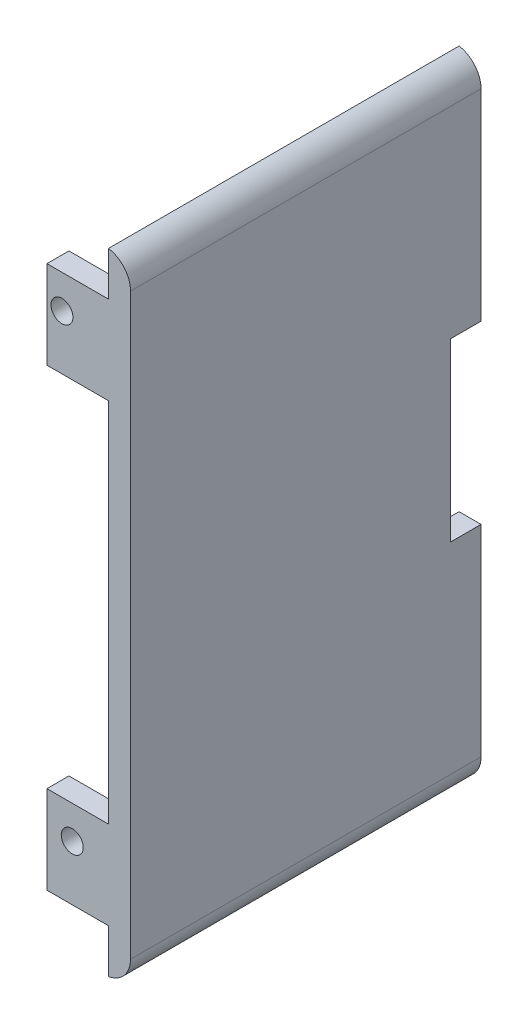
ISO-10303-21;
HEADER;
FILE_DESCRIPTION(('STEP AP214'),'2;1');
FILE_NAME('part.step','',(''),(''),'','','');
FILE_SCHEMA(('AUTOMOTIVE_DESIGN { 1 0 10303 214 1 1 1 1 }'));
ENDSEC;
DATA;
#1=APPLICATION_CONTEXT('core data for automotive mechanical design processes');
#2=APPLICATION_PROTOCOL_DEFINITION('international standard','automotive_design',2000,#1);
#3=PRODUCT_CONTEXT('',#1,'mechanical');
#4=PRODUCT('Part','Part','',(#3));
#5=PRODUCT_RELATED_PRODUCT_CATEGORY('part','',(#4));
#6=PRODUCT_DEFINITION_FORMATION('','',#4);
#7=PRODUCT_DEFINITION_CONTEXT('part definition',#1,'design');
#8=PRODUCT_DEFINITION('design','',#6,#7);
#9=PRODUCT_DEFINITION_SHAPE('','',#8);
#10=(LENGTH_UNIT() NAMED_UNIT(*) SI_UNIT(.MILLI.,.METRE.));
#11=(NAMED_UNIT(*) PLANE_ANGLE_UNIT() SI_UNIT($,.RADIAN.));
#12=(NAMED_UNIT(*) SI_UNIT($,.STERADIAN.) SOLID_ANGLE_UNIT());
#13=UNCERTAINTY_MEASURE_WITH_UNIT(LENGTH_MEASURE(1.E-05),#10,'distance_accuracy_value','');
#14=(GEOMETRIC_REPRESENTATION_CONTEXT(3) GLOBAL_UNCERTAINTY_ASSIGNED_CONTEXT((#13)) GLOBAL_UNIT_ASSIGNED_CONTEXT((#10,
#11,#12)) REPRESENTATION_CONTEXT('',''));
#15=CARTESIAN_POINT('',(0.,0.,0.));
#16=DIRECTION('',(0.,0.,1.));
#17=DIRECTION('',(1.,0.,0.));
#18=AXIS2_PLACEMENT_3D('',#15,#16,#17);
#19=CARTESIAN_POINT('',(-104.891736532619,71.4003118807174,-79.6889603598296));
#20=DIRECTION('',(0.,0.,1.));
#21=DIRECTION('',(1.,0.,0.));
#22=AXIS2_PLACEMENT_3D('',#19,#20,#21);
#23=PLANE('',#22);
#24=DIRECTION('',(0.,-1.,0.));
#25=VECTOR('',#24,1.);
#26=CARTESIAN_POINT('',(-99.8917365326188,71.4003118807174,-79.6889603598296));
#27=LINE('',#26,#25);
#28=CARTESIAN_POINT('',(-99.8917365326188,65.4842320976178,-79.6889603598296));
#29=VERTEX_POINT('',#28);
#30=CARTESIAN_POINT('',(-99.8917365326188,19.7210142017408,-79.6889603598296));
#31=VERTEX_POINT('',#30);
#32=EDGE_CURVE('E201',#29,#31,#27,.T.);
#33=ORIENTED_EDGE('',*,*,#32,.T.);
#34=DIRECTION('',(-1.,0.,0.));
#35=VECTOR('',#34,1.);
#36=CARTESIAN_POINT('',(-94.8917365326188,19.7210142017408,-79.6889603598296));
#37=LINE('',#36,#35);
#38=CARTESIAN_POINT('',(-104.891736532619,19.7210142017408,-79.6889603598296));
#39=VERTEX_POINT('',#38);
#40=EDGE_CURVE('E334',#31,#39,#37,.T.);
#41=ORIENTED_EDGE('',*,*,#40,.T.);
#42=DIRECTION('',(0.,-1.,0.));
#43=VECTOR('',#42,1.);
#44=CARTESIAN_POINT('',(-104.891736532619,71.4003118807174,-79.6889603598296));
#45=LINE('',#44,#43);
#46=CARTESIAN_POINT('',(-104.891736532619,71.4003118807174,-79.6889603598296));
#47=VERTEX_POINT('',#46);
#48=EDGE_CURVE('E183',#47,#39,#45,.T.);
#49=ORIENTED_EDGE('',*,*,#48,.F.);
#50=CARTESIAN_POINT('',(-105.891736532619,65.4842320976178,-79.6889603598296));
#51=DIRECTION('',(0.,0.,1.));
#52=DIRECTION('',(1.,0.,0.));
#53=AXIS2_PLACEMENT_3D('',#50,#51,#52);
#54=CIRCLE('',#53,6.);
#55=EDGE_CURVE('E218',#47,#29,#54,.F.);
#56=ORIENTED_EDGE('',*,*,#55,.T.);
#57=EDGE_LOOP('',(#33,#41,#49,#56));
#58=FACE_BOUND('',#57,.T.);
#59=ADVANCED_FACE('F45',(#58),#23,.F.);
#60=CARTESIAN_POINT('',(-104.891736532619,0.,0.));
#61=DIRECTION('',(1.,0.,0.));
#62=DIRECTION('',(0.,0.,-1.));
#63=AXIS2_PLACEMENT_3D('',#60,#61,#62);
#64=PLANE('',#63);
#65=ORIENTED_EDGE('',*,*,#48,.T.);
#66=DIRECTION('',(0.,0.,-1.));
#67=VECTOR('',#66,1.);
#68=CARTESIAN_POINT('',(-104.891736532619,19.7210142017408,-79.6889603598296));
#69=LINE('',#68,#67);
#70=CARTESIAN_POINT('',(-104.891736532619,19.7210142017408,-72.6889603598296));
#71=VERTEX_POINT('',#70);
#72=EDGE_CURVE('E166',#71,#39,#69,.T.);
#73=ORIENTED_EDGE('',*,*,#72,.F.);
#74=DIRECTION('',(0.,1.,0.));
#75=VECTOR('',#74,1.);
#76=CARTESIAN_POINT('',(-104.891736532619,19.7210142017408,-72.6889603598296));
#77=LINE('',#76,#75);
#78=CARTESIAN_POINT('',(-104.891736532619,-20.2789857982592,-72.6889603598296));
#79=VERTEX_POINT('',#78);
#80=EDGE_CURVE('E175',#79,#71,#77,.T.);
#81=ORIENTED_EDGE('',*,*,#80,.F.);
#82=DIRECTION('',(0.,0.,1.));
#83=VECTOR('',#82,1.);
#84=CARTESIAN_POINT('',(-104.891736532619,-20.2789857982592,-79.6889603598296));
#85=LINE('',#84,#83);
#86=CARTESIAN_POINT('',(-104.891736532619,-20.2789857982592,-79.6889603598296));
#87=VERTEX_POINT('',#86);
#88=EDGE_CURVE('E160',#87,#79,#85,.T.);
#89=ORIENTED_EDGE('',*,*,#88,.F.);
#90=CARTESIAN_POINT('',(-104.891736532619,-71.9582834772358,-79.6889603598296));
#91=VERTEX_POINT('',#90);
#92=EDGE_CURVE('E172',#87,#91,#45,.T.);
#93=ORIENTED_EDGE('',*,*,#92,.T.);
#94=DIRECTION('',(0.,0.,1.));
#95=VECTOR('',#94,1.);
#96=CARTESIAN_POINT('',(-104.891736532619,-71.9582834772358,0.));
#97=LINE('',#96,#95);
#98=CARTESIAN_POINT('',(-104.891736532619,-71.9582834772358,0.));
#99=VERTEX_POINT('',#98);
#100=EDGE_CURVE('E188',#91,#99,#97,.T.);
#101=ORIENTED_EDGE('',*,*,#100,.T.);
#102=DIRECTION('',(0.,1.,0.));
#103=VECTOR('',#102,1.);
#104=CARTESIAN_POINT('',(-104.891736532619,71.4003118807174,0.));
#105=LINE('',#104,#103);
#106=CARTESIAN_POINT('',(-104.891736532619,-61.9582834772358,0.));
#107=VERTEX_POINT('',#106);
#108=EDGE_CURVE('E190',#99,#107,#105,.T.);
#109=ORIENTED_EDGE('',*,*,#108,.T.);
#110=DIRECTION('',(0.,0.,1.));
#111=VECTOR('',#110,1.);
#112=CARTESIAN_POINT('',(-104.891736532619,-61.9582834772358,0.));
#113=LINE('',#112,#111);
#114=CARTESIAN_POINT('',(-104.891736532619,-61.9582834772358,-5.));
#115=VERTEX_POINT('',#114);
#116=EDGE_CURVE('E265',#115,#107,#113,.T.);
#117=ORIENTED_EDGE('',*,*,#116,.F.);
#118=DIRECTION('',(0.,-1.,0.));
#119=VECTOR('',#118,1.);
#120=CARTESIAN_POINT('',(-104.891736532619,-61.9582834772358,-5.));
#121=LINE('',#120,#119);
#122=CARTESIAN_POINT('',(-104.891736532619,-41.9582834772358,-5.));
#123=VERTEX_POINT('',#122);
#124=EDGE_CURVE('E269',#123,#115,#121,.T.);
#125=ORIENTED_EDGE('',*,*,#124,.F.);
#126=DIRECTION('',(0.,0.,-1.));
#127=VECTOR('',#126,1.);
#128=CARTESIAN_POINT('',(-104.891736532619,-41.9582834772358,0.));
#129=LINE('',#128,#127);
#130=CARTESIAN_POINT('',(-104.891736532619,-41.9582834772358,0.));
#131=VERTEX_POINT('',#130);
#132=EDGE_CURVE('E273',#131,#123,#129,.T.);
#133=ORIENTED_EDGE('',*,*,#132,.F.);
#134=CARTESIAN_POINT('',(-104.891736532619,41.4003118807174,0.));
#135=VERTEX_POINT('',#134);
#136=EDGE_CURVE('E347',#131,#135,#105,.T.);
#137=ORIENTED_EDGE('',*,*,#136,.T.);
#138=DIRECTION('',(0.,0.,1.));
#139=VECTOR('',#138,1.);
#140=CARTESIAN_POINT('',(-104.891736532619,41.4003118807174,0.));
#141=LINE('',#140,#139);
#142=CARTESIAN_POINT('',(-104.891736532619,41.4003118807174,-5.00000000000001));
#143=VERTEX_POINT('',#142);
#144=EDGE_CURVE('E285',#143,#135,#141,.T.);
#145=ORIENTED_EDGE('',*,*,#144,.F.);
#146=DIRECTION('',(0.,-1.,0.));
#147=VECTOR('',#146,1.);
#148=CARTESIAN_POINT('',(-104.891736532619,61.4003118807174,-5.00000000000002));
#149=LINE('',#148,#147);
#150=CARTESIAN_POINT('',(-104.891736532619,61.4003118807174,-5.00000000000002));
#151=VERTEX_POINT('',#150);
#152=EDGE_CURVE('E281',#151,#143,#149,.T.);
#153=ORIENTED_EDGE('',*,*,#152,.F.);
#154=DIRECTION('',(0.,0.,-1.));
#155=VECTOR('',#154,1.);
#156=CARTESIAN_POINT('',(-104.891736532619,61.4003118807174,0.));
#157=LINE('',#156,#155);
#158=CARTESIAN_POINT('',(-104.891736532619,61.4003118807174,0.));
#159=VERTEX_POINT('',#158);
#160=EDGE_CURVE('E277',#159,#151,#157,.T.);
#161=ORIENTED_EDGE('',*,*,#160,.F.);
#162=CARTESIAN_POINT('',(-104.891736532619,71.4003118807174,0.));
#163=VERTEX_POINT('',#162);
#164=EDGE_CURVE('E205',#159,#163,#105,.T.);
#165=ORIENTED_EDGE('',*,*,#164,.T.);
#166=DIRECTION('',(0.,0.,-1.));
#167=VECTOR('',#166,1.);
#168=CARTESIAN_POINT('',(-104.891736532619,71.4003118807174,0.));
#169=LINE('',#168,#167);
#170=EDGE_CURVE('E184',#163,#47,#169,.T.);
#171=ORIENTED_EDGE('',*,*,#170,.T.);
#172=EDGE_LOOP('',(#65,#73,#81,#89,#93,#101,#109,#117,#125,#133,#137,#145,#153,#161,#165,#171));
#173=FACE_BOUND('',#172,.T.);
#174=ADVANCED_FACE('F170',(#173),#64,.F.);
#175=CARTESIAN_POINT('',(-104.891736532619,71.4003118807174,0.));
#176=DIRECTION('',(0.,0.,-1.));
#177=DIRECTION('',(-1.,0.,0.));
#178=AXIS2_PLACEMENT_3D('',#175,#176,#177);
#179=PLANE('',#178);
#180=CARTESIAN_POINT('',(-113.140977593672,-49.4452910654279,0.));
#181=DIRECTION('',(0.,0.,-1.));
#182=DIRECTION('',(-1.,0.,0.));
#183=AXIS2_PLACEMENT_3D('',#180,#181,#182);
#184=CIRCLE('',#183,2.5);
#185=CARTESIAN_POINT('',(-115.640977593672,-49.4452910654279,0.));
#186=VERTEX_POINT('',#185);
#187=EDGE_CURVE('E318',#186,#186,#184,.T.);
#188=ORIENTED_EDGE('',*,*,#187,.T.);
#189=EDGE_LOOP('',(#188));
#190=FACE_BOUND('',#189,.T.);
#191=CARTESIAN_POINT('',(-115.476622685787,53.7780729928542,0.));
#192=DIRECTION('',(0.,0.,-1.));
#193=DIRECTION('',(-1.,0.,0.));
#194=AXIS2_PLACEMENT_3D('',#191,#192,#193);
#195=CIRCLE('',#194,2.50000000000001);
#196=CARTESIAN_POINT('',(-117.976622685787,53.7780729928542,0.));
#197=VERTEX_POINT('',#196);
#198=EDGE_CURVE('E322',#197,#197,#195,.T.);
#199=ORIENTED_EDGE('',*,*,#198,.T.);
#200=EDGE_LOOP('',(#199));
#201=FACE_BOUND('',#200,.T.);
#202=ORIENTED_EDGE('',*,*,#108,.F.);
#203=CARTESIAN_POINT('',(-105.891736532619,-66.0422036941362,0.));
#204=DIRECTION('',(0.,0.,-1.));
#205=DIRECTION('',(-1.,0.,0.));
#206=AXIS2_PLACEMENT_3D('',#203,#204,#205);
#207=CIRCLE('',#206,6.);
#208=CARTESIAN_POINT('',(-99.8917365326188,-66.0422036941362,0.));
#209=VERTEX_POINT('',#208);
#210=EDGE_CURVE('E208',#99,#209,#207,.F.);
#211=ORIENTED_EDGE('',*,*,#210,.T.);
#212=DIRECTION('',(0.,1.,0.));
#213=VECTOR('',#212,1.);
#214=CARTESIAN_POINT('',(-99.8917365326188,71.4003118807174,0.));
#215=LINE('',#214,#213);
#216=CARTESIAN_POINT('',(-99.8917365326188,65.4842320976178,0.));
#217=VERTEX_POINT('',#216);
#218=EDGE_CURVE('E197',#209,#217,#215,.T.);
#219=ORIENTED_EDGE('',*,*,#218,.T.);
#220=CARTESIAN_POINT('',(-105.891736532619,65.4842320976178,0.));
#221=DIRECTION('',(0.,0.,-1.));
#222=DIRECTION('',(-1.,0.,0.));
#223=AXIS2_PLACEMENT_3D('',#220,#221,#222);
#224=CIRCLE('',#223,6.);
#225=EDGE_CURVE('E196',#217,#163,#224,.F.);
#226=ORIENTED_EDGE('',*,*,#225,.T.);
#227=ORIENTED_EDGE('',*,*,#164,.F.);
#228=DIRECTION('',(1.,0.,0.));
#229=VECTOR('',#228,1.);
#230=CARTESIAN_POINT('',(-118.891736532619,61.4003118807174,0.));
#231=LINE('',#230,#229);
#232=CARTESIAN_POINT('',(-118.891736532619,61.4003118807174,0.));
#233=VERTEX_POINT('',#232);
#234=EDGE_CURVE('E314',#233,#159,#231,.T.);
#235=ORIENTED_EDGE('',*,*,#234,.F.);
#236=DIRECTION('',(0.,1.,0.));
#237=VECTOR('',#236,1.);
#238=CARTESIAN_POINT('',(-118.891736532619,61.4003118807174,0.));
#239=LINE('',#238,#237);
#240=CARTESIAN_POINT('',(-118.891736532619,41.4003118807174,0.));
#241=VERTEX_POINT('',#240);
#242=EDGE_CURVE('E289',#241,#233,#239,.T.);
#243=ORIENTED_EDGE('',*,*,#242,.F.);
#244=DIRECTION('',(1.,0.,0.));
#245=VECTOR('',#244,1.);
#246=CARTESIAN_POINT('',(-118.891736532619,41.4003118807174,0.));
#247=LINE('',#246,#245);
#248=EDGE_CURVE('E302',#241,#135,#247,.T.);
#249=ORIENTED_EDGE('',*,*,#248,.T.);
#250=ORIENTED_EDGE('',*,*,#136,.F.);
#251=DIRECTION('',(1.,0.,0.));
#252=VECTOR('',#251,1.);
#253=CARTESIAN_POINT('',(-118.891736532619,-41.9582834772358,0.));
#254=LINE('',#253,#252);
#255=CARTESIAN_POINT('',(-118.891736532619,-41.9582834772358,0.));
#256=VERTEX_POINT('',#255);
#257=EDGE_CURVE('E200',#256,#131,#254,.T.);
#258=ORIENTED_EDGE('',*,*,#257,.F.);
#259=DIRECTION('',(0.,1.,0.));
#260=VECTOR('',#259,1.);
#261=CARTESIAN_POINT('',(-118.891736532619,-61.9582834772358,0.));
#262=LINE('',#261,#260);
#263=CARTESIAN_POINT('',(-118.891736532619,-61.9582834772358,0.));
#264=VERTEX_POINT('',#263);
#265=EDGE_CURVE('E261',#264,#256,#262,.T.);
#266=ORIENTED_EDGE('',*,*,#265,.F.);
#267=DIRECTION('',(1.,0.,0.));
#268=VECTOR('',#267,1.);
#269=CARTESIAN_POINT('',(-118.891736532619,-61.9582834772358,0.));
#270=LINE('',#269,#268);
#271=EDGE_CURVE('E248',#264,#107,#270,.T.);
#272=ORIENTED_EDGE('',*,*,#271,.T.);
#273=EDGE_LOOP('',(#202,#211,#219,#226,#227,#235,#243,#249,#250,#258,#266,#272));
#274=FACE_BOUND('',#273,.T.);
#275=ADVANCED_FACE('F377',(#190,#201,#274),#179,.F.);
#276=ORIENTED_EDGE('',*,*,#92,.F.);
#277=DIRECTION('',(-1.,0.,0.));
#278=VECTOR('',#277,1.);
#279=CARTESIAN_POINT('',(-94.8917365326188,-20.2789857982592,-79.6889603598296));
#280=LINE('',#279,#278);
#281=CARTESIAN_POINT('',(-99.8917365326188,-20.2789857982592,-79.6889603598296));
#282=VERTEX_POINT('',#281);
#283=EDGE_CURVE('E157',#282,#87,#280,.T.);
#284=ORIENTED_EDGE('',*,*,#283,.F.);
#285=CARTESIAN_POINT('',(-99.8917365326188,-66.0422036941362,-79.6889603598296));
#286=VERTEX_POINT('',#285);
#287=EDGE_CURVE('E69',#282,#286,#27,.T.);
#288=ORIENTED_EDGE('',*,*,#287,.T.);
#289=CARTESIAN_POINT('',(-105.891736532619,-66.0422036941362,-79.6889603598296));
#290=DIRECTION('',(0.,0.,1.));
#291=DIRECTION('',(1.,0.,0.));
#292=AXIS2_PLACEMENT_3D('',#289,#290,#291);
#293=CIRCLE('',#292,6.);
#294=EDGE_CURVE('E180',#286,#91,#293,.F.);
#295=ORIENTED_EDGE('',*,*,#294,.T.);
#296=EDGE_LOOP('',(#276,#284,#288,#295));
#297=FACE_BOUND('',#296,.T.);
#298=ADVANCED_FACE('F178',(#297),#23,.F.);
#299=CARTESIAN_POINT('',(-99.8917365326188,0.,0.));
#300=DIRECTION('',(1.,0.,0.));
#301=DIRECTION('',(0.,0.,-1.));
#302=AXIS2_PLACEMENT_3D('',#299,#300,#301);
#303=PLANE('',#302);
#304=DIRECTION('',(0.,0.,1.));
#305=VECTOR('',#304,1.);
#306=CARTESIAN_POINT('',(-99.8917365326188,19.7210142017408,0.));
#307=LINE('',#306,#305);
#308=CARTESIAN_POINT('',(-99.8917365326188,19.7210142017408,-72.6889603598296));
#309=VERTEX_POINT('',#308);
#310=EDGE_CURVE('E11',#31,#309,#307,.T.);
#311=ORIENTED_EDGE('',*,*,#310,.F.);
#312=ORIENTED_EDGE('',*,*,#32,.F.);
#313=DIRECTION('',(0.,0.,-1.));
#314=VECTOR('',#313,1.);
#315=CARTESIAN_POINT('',(-99.8917365326188,65.4842320976178,0.));
#316=LINE('',#315,#314);
#317=EDGE_CURVE('E211',#29,#217,#316,.F.);
#318=ORIENTED_EDGE('',*,*,#317,.T.);
#319=ORIENTED_EDGE('',*,*,#218,.F.);
#320=DIRECTION('',(0.,0.,1.));
#321=VECTOR('',#320,1.);
#322=CARTESIAN_POINT('',(-99.8917365326188,-66.0422036941362,-79.6889603598296));
#323=LINE('',#322,#321);
#324=EDGE_CURVE('E215',#209,#286,#323,.F.);
#325=ORIENTED_EDGE('',*,*,#324,.T.);
#326=ORIENTED_EDGE('',*,*,#287,.F.);
#327=DIRECTION('',(0.,0.,-1.));
#328=VECTOR('',#327,1.);
#329=CARTESIAN_POINT('',(-99.8917365326188,-20.2789857982592,0.));
#330=LINE('',#329,#328);
#331=CARTESIAN_POINT('',(-99.8917365326188,-20.2789857982592,-72.6889603598296));
#332=VERTEX_POINT('',#331);
#333=EDGE_CURVE('E163',#332,#282,#330,.T.);
#334=ORIENTED_EDGE('',*,*,#333,.F.);
#335=DIRECTION('',(0.,-1.,0.));
#336=VECTOR('',#335,1.);
#337=CARTESIAN_POINT('',(-99.8917365326188,0.,-72.6889603598296));
#338=LINE('',#337,#336);
#339=EDGE_CURVE('E54',#309,#332,#338,.T.);
#340=ORIENTED_EDGE('',*,*,#339,.F.);
#341=EDGE_LOOP('',(#311,#312,#318,#319,#325,#326,#334,#340));
#342=FACE_BOUND('',#341,.T.);
#343=ADVANCED_FACE('F232',(#342),#303,.T.);
#344=CARTESIAN_POINT('',(-118.891736532619,-41.9582834772358,0.));
#345=DIRECTION('',(0.,-1.,0.));
#346=DIRECTION('',(0.,0.,-1.));
#347=AXIS2_PLACEMENT_3D('',#344,#345,#346);
#348=PLANE('',#347);
#349=ORIENTED_EDGE('',*,*,#132,.T.);
#350=DIRECTION('',(1.,0.,0.));
#351=VECTOR('',#350,1.);
#352=CARTESIAN_POINT('',(-118.891736532619,-41.9582834772358,-5.));
#353=LINE('',#352,#351);
#354=CARTESIAN_POINT('',(-118.891736532619,-41.9582834772358,-5.));
#355=VERTEX_POINT('',#354);
#356=EDGE_CURVE('E240',#355,#123,#353,.T.);
#357=ORIENTED_EDGE('',*,*,#356,.F.);
#358=DIRECTION('',(0.,0.,-1.));
#359=VECTOR('',#358,1.);
#360=CARTESIAN_POINT('',(-118.891736532619,-41.9582834772358,0.));
#361=LINE('',#360,#359);
#362=EDGE_CURVE('E258',#256,#355,#361,.T.);
#363=ORIENTED_EDGE('',*,*,#362,.F.);
#364=ORIENTED_EDGE('',*,*,#257,.T.);
#365=EDGE_LOOP('',(#349,#357,#363,#364));
#366=FACE_BOUND('',#365,.T.);
#367=ADVANCED_FACE('F385',(#366),#348,.F.);
#368=CARTESIAN_POINT('',(-118.891736532619,-61.9582834772358,-5.));
#369=DIRECTION('',(0.,0.,1.));
#370=DIRECTION('',(0.,-1.,0.));
#371=AXIS2_PLACEMENT_3D('',#368,#369,#370);
#372=PLANE('',#371);
#373=CARTESIAN_POINT('',(-113.140977593672,-49.4452910654279,-5.));
#374=DIRECTION('',(0.,0.,-1.));
#375=DIRECTION('',(-1.,0.,0.));
#376=AXIS2_PLACEMENT_3D('',#373,#374,#375);
#377=CIRCLE('',#376,2.5);
#378=CARTESIAN_POINT('',(-115.640977593672,-49.4452910654279,-5.));
#379=VERTEX_POINT('',#378);
#380=EDGE_CURVE('E326',#379,#379,#377,.T.);
#381=ORIENTED_EDGE('',*,*,#380,.F.);
#382=EDGE_LOOP('',(#381));
#383=FACE_BOUND('',#382,.T.);
#384=ORIENTED_EDGE('',*,*,#124,.T.);
#385=DIRECTION('',(1.,0.,0.));
#386=VECTOR('',#385,1.);
#387=CARTESIAN_POINT('',(-118.891736532619,-61.9582834772358,-5.));
#388=LINE('',#387,#386);
#389=CARTESIAN_POINT('',(-118.891736532619,-61.9582834772358,-5.));
#390=VERTEX_POINT('',#389);
#391=EDGE_CURVE('E244',#390,#115,#388,.T.);
#392=ORIENTED_EDGE('',*,*,#391,.F.);
#393=DIRECTION('',(0.,-1.,0.));
#394=VECTOR('',#393,1.);
#395=CARTESIAN_POINT('',(-118.891736532619,-61.9582834772358,-5.));
#396=LINE('',#395,#394);
#397=EDGE_CURVE('E255',#355,#390,#396,.T.);
#398=ORIENTED_EDGE('',*,*,#397,.F.);
#399=ORIENTED_EDGE('',*,*,#356,.T.);
#400=EDGE_LOOP('',(#384,#392,#398,#399));
#401=FACE_BOUND('',#400,.T.);
#402=ADVANCED_FACE('F407',(#383,#401),#372,.F.);
#403=CARTESIAN_POINT('',(-118.891736532619,-61.9582834772358,0.));
#404=DIRECTION('',(0.,1.,0.));
#405=DIRECTION('',(0.,0.,1.));
#406=AXIS2_PLACEMENT_3D('',#403,#404,#405);
#407=PLANE('',#406);
#408=ORIENTED_EDGE('',*,*,#116,.T.);
#409=ORIENTED_EDGE('',*,*,#271,.F.);
#410=DIRECTION('',(0.,0.,1.));
#411=VECTOR('',#410,1.);
#412=CARTESIAN_POINT('',(-118.891736532619,-61.9582834772358,0.));
#413=LINE('',#412,#411);
#414=EDGE_CURVE('E252',#390,#264,#413,.T.);
#415=ORIENTED_EDGE('',*,*,#414,.F.);
#416=ORIENTED_EDGE('',*,*,#391,.T.);
#417=EDGE_LOOP('',(#408,#409,#415,#416));
#418=FACE_BOUND('',#417,.T.);
#419=ADVANCED_FACE('F404',(#418),#407,.F.);
#420=CARTESIAN_POINT('',(-118.891736532619,0.,0.));
#421=DIRECTION('',(-1.,0.,0.));
#422=DIRECTION('',(0.,0.,1.));
#423=AXIS2_PLACEMENT_3D('',#420,#421,#422);
#424=PLANE('',#423);
#425=ORIENTED_EDGE('',*,*,#265,.T.);
#426=ORIENTED_EDGE('',*,*,#362,.T.);
#427=ORIENTED_EDGE('',*,*,#397,.T.);
#428=ORIENTED_EDGE('',*,*,#414,.T.);
#429=EDGE_LOOP('',(#425,#426,#427,#428));
#430=FACE_BOUND('',#429,.T.);
#431=ADVANCED_FACE('F438',(#430),#424,.T.);
#432=CARTESIAN_POINT('',(-118.891736532619,61.4003118807174,0.));
#433=DIRECTION('',(0.,-1.,0.));
#434=DIRECTION('',(0.,0.,-1.));
#435=AXIS2_PLACEMENT_3D('',#432,#433,#434);
#436=PLANE('',#435);
#437=ORIENTED_EDGE('',*,*,#160,.T.);
#438=DIRECTION('',(1.,0.,0.));
#439=VECTOR('',#438,1.);
#440=CARTESIAN_POINT('',(-118.891736532619,61.4003118807174,-5.00000000000002));
#441=LINE('',#440,#439);
#442=CARTESIAN_POINT('',(-118.891736532619,61.4003118807174,-5.00000000000002));
#443=VERTEX_POINT('',#442);
#444=EDGE_CURVE('E310',#443,#151,#441,.T.);
#445=ORIENTED_EDGE('',*,*,#444,.F.);
#446=DIRECTION('',(0.,0.,-1.));
#447=VECTOR('',#446,1.);
#448=CARTESIAN_POINT('',(-118.891736532619,61.4003118807174,0.));
#449=LINE('',#448,#447);
#450=EDGE_CURVE('E293',#233,#443,#449,.T.);
#451=ORIENTED_EDGE('',*,*,#450,.F.);
#452=ORIENTED_EDGE('',*,*,#234,.T.);
#453=EDGE_LOOP('',(#437,#445,#451,#452));
#454=FACE_BOUND('',#453,.T.);
#455=ADVANCED_FACE('F423',(#454),#436,.F.);
#456=CARTESIAN_POINT('',(-118.891736532619,61.4003118807174,-5.00000000000002));
#457=DIRECTION('',(0.,0.,1.));
#458=DIRECTION('',(0.,-1.,0.));
#459=AXIS2_PLACEMENT_3D('',#456,#457,#458);
#460=PLANE('',#459);
#461=CARTESIAN_POINT('',(-115.476622685787,53.7780729928542,-5.));
#462=DIRECTION('',(0.,0.,-1.));
#463=DIRECTION('',(-1.,0.,0.));
#464=AXIS2_PLACEMENT_3D('',#461,#462,#463);
#465=CIRCLE('',#464,2.50000000000001);
#466=CARTESIAN_POINT('',(-117.976622685787,53.7780729928542,-5.));
#467=VERTEX_POINT('',#466);
#468=EDGE_CURVE('E330',#467,#467,#465,.T.);
#469=ORIENTED_EDGE('',*,*,#468,.F.);
#470=EDGE_LOOP('',(#469));
#471=FACE_BOUND('',#470,.T.);
#472=ORIENTED_EDGE('',*,*,#152,.T.);
#473=DIRECTION('',(1.,0.,0.));
#474=VECTOR('',#473,1.);
#475=CARTESIAN_POINT('',(-118.891736532619,41.4003118807174,-5.00000000000001));
#476=LINE('',#475,#474);
#477=CARTESIAN_POINT('',(-118.891736532619,41.4003118807174,-5.00000000000001));
#478=VERTEX_POINT('',#477);
#479=EDGE_CURVE('E306',#478,#143,#476,.T.);
#480=ORIENTED_EDGE('',*,*,#479,.F.);
#481=DIRECTION('',(0.,-1.,0.));
#482=VECTOR('',#481,1.);
#483=CARTESIAN_POINT('',(-118.891736532619,61.4003118807174,-5.00000000000002));
#484=LINE('',#483,#482);
#485=EDGE_CURVE('E296',#443,#478,#484,.T.);
#486=ORIENTED_EDGE('',*,*,#485,.F.);
#487=ORIENTED_EDGE('',*,*,#444,.T.);
#488=EDGE_LOOP('',(#472,#480,#486,#487));
#489=FACE_BOUND('',#488,.T.);
#490=ADVANCED_FACE('F419',(#471,#489),#460,.F.);
#491=CARTESIAN_POINT('',(-118.891736532619,41.4003118807174,0.));
#492=DIRECTION('',(0.,1.,0.));
#493=DIRECTION('',(0.,0.,1.));
#494=AXIS2_PLACEMENT_3D('',#491,#492,#493);
#495=PLANE('',#494);
#496=ORIENTED_EDGE('',*,*,#144,.T.);
#497=ORIENTED_EDGE('',*,*,#248,.F.);
#498=DIRECTION('',(0.,0.,1.));
#499=VECTOR('',#498,1.);
#500=CARTESIAN_POINT('',(-118.891736532619,41.4003118807174,0.));
#501=LINE('',#500,#499);
#502=EDGE_CURVE('E299',#478,#241,#501,.T.);
#503=ORIENTED_EDGE('',*,*,#502,.F.);
#504=ORIENTED_EDGE('',*,*,#479,.T.);
#505=EDGE_LOOP('',(#496,#497,#503,#504));
#506=FACE_BOUND('',#505,.T.);
#507=ADVANCED_FACE('F416',(#506),#495,.F.);
#508=CARTESIAN_POINT('',(-118.891736532619,0.,0.));
#509=DIRECTION('',(1.,0.,0.));
#510=DIRECTION('',(0.,0.,-1.));
#511=AXIS2_PLACEMENT_3D('',#508,#509,#510);
#512=PLANE('',#511);
#513=ORIENTED_EDGE('',*,*,#242,.T.);
#514=ORIENTED_EDGE('',*,*,#450,.T.);
#515=ORIENTED_EDGE('',*,*,#485,.T.);
#516=ORIENTED_EDGE('',*,*,#502,.T.);
#517=EDGE_LOOP('',(#513,#514,#515,#516));
#518=FACE_BOUND('',#517,.T.);
#519=ADVANCED_FACE('F425',(#518),#512,.F.);
#520=CARTESIAN_POINT('',(-115.476622685787,53.7780729928542,80.1241320149708));
#521=DIRECTION('',(0.,0.,-1.));
#522=DIRECTION('',(-1.,0.,0.));
#523=AXIS2_PLACEMENT_3D('',#520,#521,#522);
#524=CYLINDRICAL_SURFACE('',#523,2.50000000000001);
#525=ORIENTED_EDGE('',*,*,#468,.T.);
#526=EDGE_LOOP('',(#525));
#527=FACE_BOUND('',#526,.T.);
#528=ORIENTED_EDGE('',*,*,#198,.F.);
#529=EDGE_LOOP('',(#528));
#530=FACE_BOUND('',#529,.T.);
#531=ADVANCED_FACE('F396',(#527,#530),#524,.F.);
#532=CARTESIAN_POINT('',(-113.140977593672,-49.4452910654279,80.1241320149708));
#533=DIRECTION('',(0.,0.,-1.));
#534=DIRECTION('',(-1.,0.,0.));
#535=AXIS2_PLACEMENT_3D('',#532,#533,#534);
#536=CYLINDRICAL_SURFACE('',#535,2.5);
#537=ORIENTED_EDGE('',*,*,#380,.T.);
#538=EDGE_LOOP('',(#537));
#539=FACE_BOUND('',#538,.T.);
#540=ORIENTED_EDGE('',*,*,#187,.F.);
#541=EDGE_LOOP('',(#540));
#542=FACE_BOUND('',#541,.T.);
#543=ADVANCED_FACE('F391',(#539,#542),#536,.F.);
#544=CARTESIAN_POINT('',(-105.891736532619,-66.0422036941362,0.));
#545=DIRECTION('',(0.,0.,-1.));
#546=DIRECTION('',(0.,1.,0.));
#547=AXIS2_PLACEMENT_3D('',#544,#545,#546);
#548=CYLINDRICAL_SURFACE('',#547,6.);
#549=ORIENTED_EDGE('',*,*,#294,.F.);
#550=ORIENTED_EDGE('',*,*,#324,.F.);
#551=ORIENTED_EDGE('',*,*,#210,.F.);
#552=ORIENTED_EDGE('',*,*,#100,.F.);
#553=EDGE_LOOP('',(#549,#550,#551,#552));
#554=FACE_BOUND('',#553,.T.);
#555=ADVANCED_FACE('F371',(#554),#548,.T.);
#556=CARTESIAN_POINT('',(-105.891736532619,65.4842320976178,0.));
#557=DIRECTION('',(0.,0.,1.));
#558=DIRECTION('',(0.,-1.,0.));
#559=AXIS2_PLACEMENT_3D('',#556,#557,#558);
#560=CYLINDRICAL_SURFACE('',#559,6.);
#561=ORIENTED_EDGE('',*,*,#225,.F.);
#562=ORIENTED_EDGE('',*,*,#317,.F.);
#563=ORIENTED_EDGE('',*,*,#55,.F.);
#564=ORIENTED_EDGE('',*,*,#170,.F.);
#565=EDGE_LOOP('',(#561,#562,#563,#564));
#566=FACE_BOUND('',#565,.T.);
#567=ADVANCED_FACE('F47',(#566),#560,.T.);
#568=CARTESIAN_POINT('',(-94.8917365326188,19.7210142017408,-79.6889603598296));
#569=DIRECTION('',(0.,1.,0.));
#570=DIRECTION('',(0.,0.,1.));
#571=AXIS2_PLACEMENT_3D('',#568,#569,#570);
#572=PLANE('',#571);
#573=ORIENTED_EDGE('',*,*,#310,.T.);
#574=DIRECTION('',(-1.,0.,0.));
#575=VECTOR('',#574,1.);
#576=CARTESIAN_POINT('',(-94.8917365326188,19.7210142017408,-72.6889603598296));
#577=LINE('',#576,#575);
#578=EDGE_CURVE('E229',#309,#71,#577,.T.);
#579=ORIENTED_EDGE('',*,*,#578,.T.);
#580=ORIENTED_EDGE('',*,*,#72,.T.);
#581=ORIENTED_EDGE('',*,*,#40,.F.);
#582=EDGE_LOOP('',(#573,#579,#580,#581));
#583=FACE_BOUND('',#582,.T.);
#584=ADVANCED_FACE('F362',(#583),#572,.F.);
#585=CARTESIAN_POINT('',(-94.8917365326188,19.7210142017408,-72.6889603598296));
#586=DIRECTION('',(0.,0.,1.));
#587=DIRECTION('',(1.,0.,0.));
#588=AXIS2_PLACEMENT_3D('',#585,#586,#587);
#589=PLANE('',#588);
#590=ORIENTED_EDGE('',*,*,#339,.T.);
#591=DIRECTION('',(-1.,0.,0.));
#592=VECTOR('',#591,1.);
#593=CARTESIAN_POINT('',(-94.8917365326188,-20.2789857982592,-72.6889603598296));
#594=LINE('',#593,#592);
#595=EDGE_CURVE('E61',#332,#79,#594,.T.);
#596=ORIENTED_EDGE('',*,*,#595,.T.);
#597=ORIENTED_EDGE('',*,*,#80,.T.);
#598=ORIENTED_EDGE('',*,*,#578,.F.);
#599=EDGE_LOOP('',(#590,#596,#597,#598));
#600=FACE_BOUND('',#599,.T.);
#601=ADVANCED_FACE('F228',(#600),#589,.F.);
#602=CARTESIAN_POINT('',(-94.8917365326188,-20.2789857982592,-79.6889603598296));
#603=DIRECTION('',(0.,-1.,0.));
#604=DIRECTION('',(0.,0.,-1.));
#605=AXIS2_PLACEMENT_3D('',#602,#603,#604);
#606=PLANE('',#605);
#607=ORIENTED_EDGE('',*,*,#333,.T.);
#608=ORIENTED_EDGE('',*,*,#283,.T.);
#609=ORIENTED_EDGE('',*,*,#88,.T.);
#610=ORIENTED_EDGE('',*,*,#595,.F.);
#611=EDGE_LOOP('',(#607,#608,#609,#610));
#612=FACE_BOUND('',#611,.T.);
#613=ADVANCED_FACE('F159',(#612),#606,.F.);
#614=CLOSED_SHELL('',(#59,#174,#275,#298,#343,#367,#402,#419,#431,#455,#490,#507,#519,#531,#543,
#555,#567,#584,#601,#613));
#615=MANIFOLD_SOLID_BREP('B2',#614);
#616=ADVANCED_BREP_SHAPE_REPRESENTATION('',(#18,#615),#14);
#617=SHAPE_DEFINITION_REPRESENTATION(#9,#616);
ENDSEC;
END-ISO-10303-21;
